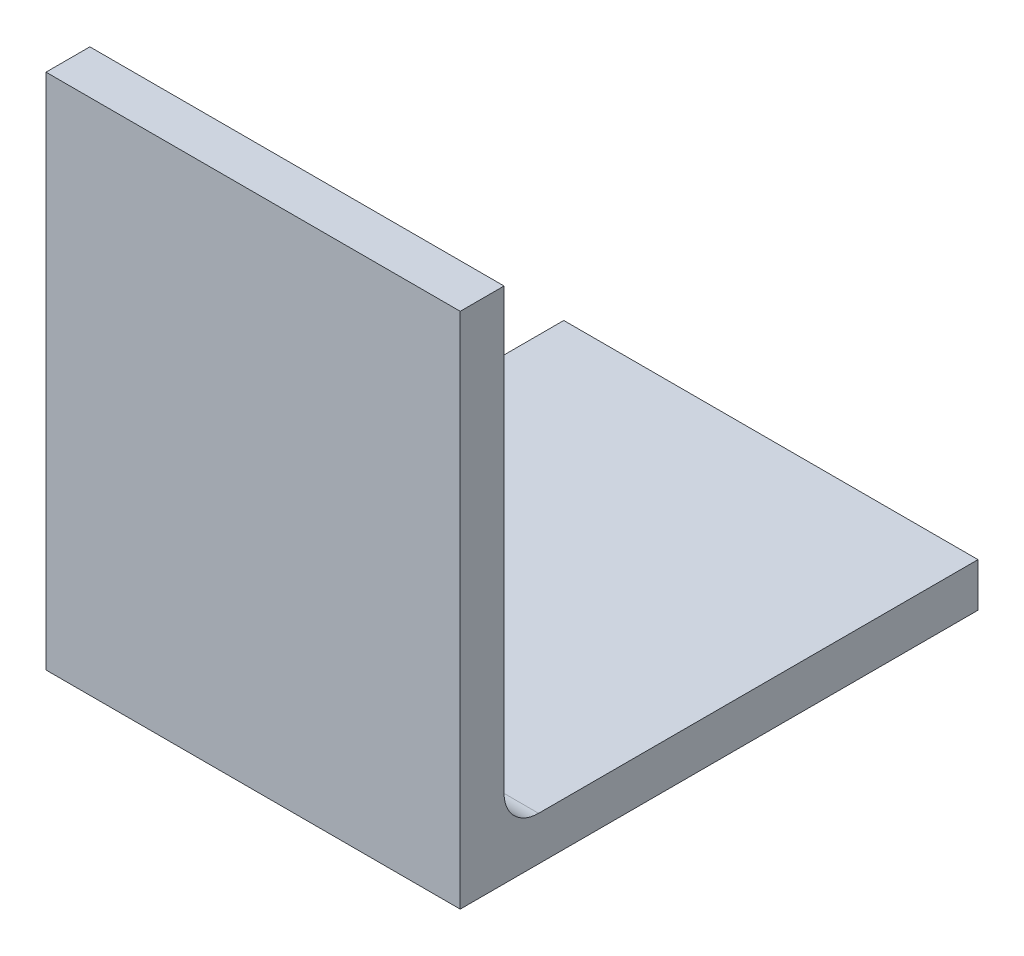
ISO-10303-21;
HEADER;
FILE_DESCRIPTION(('STEP AP214'),'2;1');
FILE_NAME('part.step','',(''),(''),'','','');
FILE_SCHEMA(('AUTOMOTIVE_DESIGN { 1 0 10303 214 1 1 1 1 }'));
ENDSEC;
DATA;
#1=APPLICATION_CONTEXT('core data for automotive mechanical design processes');
#2=APPLICATION_PROTOCOL_DEFINITION('international standard','automotive_design',2000,#1);
#3=PRODUCT_CONTEXT('',#1,'mechanical');
#4=PRODUCT('Part','Part','',(#3));
#5=PRODUCT_RELATED_PRODUCT_CATEGORY('part','',(#4));
#6=PRODUCT_DEFINITION_FORMATION('','',#4);
#7=PRODUCT_DEFINITION_CONTEXT('part definition',#1,'design');
#8=PRODUCT_DEFINITION('design','',#6,#7);
#9=PRODUCT_DEFINITION_SHAPE('','',#8);
#10=(LENGTH_UNIT() NAMED_UNIT(*) SI_UNIT(.MILLI.,.METRE.));
#11=(NAMED_UNIT(*) PLANE_ANGLE_UNIT() SI_UNIT($,.RADIAN.));
#12=(NAMED_UNIT(*) SI_UNIT($,.STERADIAN.) SOLID_ANGLE_UNIT());
#13=UNCERTAINTY_MEASURE_WITH_UNIT(LENGTH_MEASURE(1.E-05),#10,'distance_accuracy_value','');
#14=(GEOMETRIC_REPRESENTATION_CONTEXT(3) GLOBAL_UNCERTAINTY_ASSIGNED_CONTEXT((#13)) GLOBAL_UNIT_ASSIGNED_CONTEXT((#10,
#11,#12)) REPRESENTATION_CONTEXT('',''));
#15=CARTESIAN_POINT('',(0.,0.,0.));
#16=DIRECTION('',(0.,0.,1.));
#17=DIRECTION('',(1.,0.,0.));
#18=AXIS2_PLACEMENT_3D('',#15,#16,#17);
#19=CARTESIAN_POINT('',(60.,0.,0.));
#20=DIRECTION('',(0.,1.,0.));
#21=DIRECTION('',(0.,0.,1.));
#22=AXIS2_PLACEMENT_3D('',#19,#20,#21);
#23=PLANE('',#22);
#24=DIRECTION('',(0.,0.,-1.));
#25=VECTOR('',#24,1.);
#26=CARTESIAN_POINT('',(-60.,0.,0.));
#27=LINE('',#26,#25);
#28=CARTESIAN_POINT('',(-60.,0.,0.));
#29=VERTEX_POINT('',#28);
#30=CARTESIAN_POINT('',(-60.,0.,-150.));
#31=VERTEX_POINT('',#30);
#32=EDGE_CURVE('E123',#29,#31,#27,.T.);
#33=ORIENTED_EDGE('',*,*,#32,.T.);
#34=DIRECTION('',(-1.,0.,0.));
#35=VECTOR('',#34,1.);
#36=CARTESIAN_POINT('',(60.,0.,-150.));
#37=LINE('',#36,#35);
#38=CARTESIAN_POINT('',(60.,0.,-150.));
#39=VERTEX_POINT('',#38);
#40=EDGE_CURVE('E11',#39,#31,#37,.T.);
#41=ORIENTED_EDGE('',*,*,#40,.F.);
#42=DIRECTION('',(0.,0.,-1.));
#43=VECTOR('',#42,1.);
#44=CARTESIAN_POINT('',(60.,0.,0.));
#45=LINE('',#44,#43);
#46=CARTESIAN_POINT('',(60.,0.,0.));
#47=VERTEX_POINT('',#46);
#48=EDGE_CURVE('E135',#47,#39,#45,.T.);
#49=ORIENTED_EDGE('',*,*,#48,.F.);
#50=DIRECTION('',(-1.,0.,0.));
#51=VECTOR('',#50,1.);
#52=CARTESIAN_POINT('',(60.,0.,0.));
#53=LINE('',#52,#51);
#54=EDGE_CURVE('E119',#47,#29,#53,.T.);
#55=ORIENTED_EDGE('',*,*,#54,.T.);
#56=EDGE_LOOP('',(#33,#41,#49,#55));
#57=FACE_BOUND('',#56,.T.);
#58=ADVANCED_FACE('F33',(#57),#23,.F.);
#59=CARTESIAN_POINT('',(60.,0.,-150.));
#60=DIRECTION('',(0.,0.,1.));
#61=DIRECTION('',(1.,0.,0.));
#62=AXIS2_PLACEMENT_3D('',#59,#60,#61);
#63=PLANE('',#62);
#64=DIRECTION('',(0.,1.,0.));
#65=VECTOR('',#64,1.);
#66=CARTESIAN_POINT('',(-60.,0.,-150.));
#67=LINE('',#66,#65);
#68=CARTESIAN_POINT('',(-60.,12.7,-150.));
#69=VERTEX_POINT('',#68);
#70=EDGE_CURVE('E126',#31,#69,#67,.T.);
#71=ORIENTED_EDGE('',*,*,#70,.T.);
#72=DIRECTION('',(-1.,0.,0.));
#73=VECTOR('',#72,1.);
#74=CARTESIAN_POINT('',(60.,12.7,-150.));
#75=LINE('',#74,#73);
#76=CARTESIAN_POINT('',(60.,12.7,-150.));
#77=VERTEX_POINT('',#76);
#78=EDGE_CURVE('E41',#77,#69,#75,.T.);
#79=ORIENTED_EDGE('',*,*,#78,.F.);
#80=DIRECTION('',(0.,1.,0.));
#81=VECTOR('',#80,1.);
#82=CARTESIAN_POINT('',(60.,0.,-150.));
#83=LINE('',#82,#81);
#84=EDGE_CURVE('E89',#39,#77,#83,.T.);
#85=ORIENTED_EDGE('',*,*,#84,.F.);
#86=ORIENTED_EDGE('',*,*,#40,.T.);
#87=EDGE_LOOP('',(#71,#79,#85,#86));
#88=FACE_BOUND('',#87,.T.);
#89=ADVANCED_FACE('F160',(#88),#63,.F.);
#90=CARTESIAN_POINT('',(60.,12.7,-22.7000000000001));
#91=DIRECTION('',(0.,-1.,0.));
#92=DIRECTION('',(0.,0.,-1.));
#93=AXIS2_PLACEMENT_3D('',#90,#91,#92);
#94=PLANE('',#93);
#95=DIRECTION('',(0.,0.,1.));
#96=VECTOR('',#95,1.);
#97=CARTESIAN_POINT('',(-60.,12.7,-22.7000000000001));
#98=LINE('',#97,#96);
#99=CARTESIAN_POINT('',(-60.,12.7,-22.7000000000001));
#100=VERTEX_POINT('',#99);
#101=EDGE_CURVE('E128',#69,#100,#98,.T.);
#102=ORIENTED_EDGE('',*,*,#101,.T.);
#103=DIRECTION('',(-1.,0.,0.));
#104=VECTOR('',#103,1.);
#105=CARTESIAN_POINT('',(60.,12.7,-22.7000000000001));
#106=LINE('',#105,#104);
#107=CARTESIAN_POINT('',(60.,12.7,-22.7000000000001));
#108=VERTEX_POINT('',#107);
#109=EDGE_CURVE('E139',#108,#100,#106,.T.);
#110=ORIENTED_EDGE('',*,*,#109,.F.);
#111=DIRECTION('',(0.,0.,1.));
#112=VECTOR('',#111,1.);
#113=CARTESIAN_POINT('',(60.,12.7,-22.7000000000001));
#114=LINE('',#113,#112);
#115=EDGE_CURVE('E147',#77,#108,#114,.T.);
#116=ORIENTED_EDGE('',*,*,#115,.F.);
#117=ORIENTED_EDGE('',*,*,#78,.T.);
#118=EDGE_LOOP('',(#102,#110,#116,#117));
#119=FACE_BOUND('',#118,.T.);
#120=ADVANCED_FACE('F145',(#119),#94,.F.);
#121=CARTESIAN_POINT('',(60.,22.7,-22.7));
#122=DIRECTION('',(-1.,0.,0.));
#123=DIRECTION('',(0.,0.,1.));
#124=AXIS2_PLACEMENT_3D('',#121,#122,#123);
#125=CYLINDRICAL_SURFACE('',#124,10.);
#126=CARTESIAN_POINT('',(-60.,22.7,-22.7));
#127=DIRECTION('',(-1.,0.,0.));
#128=DIRECTION('',(0.,0.,1.));
#129=AXIS2_PLACEMENT_3D('',#126,#127,#128);
#130=CIRCLE('',#129,10.);
#131=CARTESIAN_POINT('',(-60.,22.7000000000001,-12.7));
#132=VERTEX_POINT('',#131);
#133=EDGE_CURVE('E130',#100,#132,#130,.T.);
#134=ORIENTED_EDGE('',*,*,#133,.T.);
#135=DIRECTION('',(-1.,0.,0.));
#136=VECTOR('',#135,1.);
#137=CARTESIAN_POINT('',(60.,22.7000000000001,-12.7));
#138=LINE('',#137,#136);
#139=CARTESIAN_POINT('',(60.,22.7000000000001,-12.7));
#140=VERTEX_POINT('',#139);
#141=EDGE_CURVE('E114',#140,#132,#138,.T.);
#142=ORIENTED_EDGE('',*,*,#141,.F.);
#143=CARTESIAN_POINT('',(60.,22.7,-22.7));
#144=DIRECTION('',(-1.,0.,0.));
#145=DIRECTION('',(0.,0.,1.));
#146=AXIS2_PLACEMENT_3D('',#143,#144,#145);
#147=CIRCLE('',#146,10.);
#148=EDGE_CURVE('E105',#108,#140,#147,.T.);
#149=ORIENTED_EDGE('',*,*,#148,.F.);
#150=ORIENTED_EDGE('',*,*,#109,.T.);
#151=EDGE_LOOP('',(#134,#142,#149,#150));
#152=FACE_BOUND('',#151,.T.);
#153=ADVANCED_FACE('F153',(#152),#125,.F.);
#154=CARTESIAN_POINT('',(60.,22.7000000000001,-12.7));
#155=DIRECTION('',(0.,0.,1.));
#156=DIRECTION('',(1.,0.,0.));
#157=AXIS2_PLACEMENT_3D('',#154,#155,#156);
#158=PLANE('',#157);
#159=DIRECTION('',(0.,1.,0.));
#160=VECTOR('',#159,1.);
#161=CARTESIAN_POINT('',(-60.,22.7000000000001,-12.7));
#162=LINE('',#161,#160);
#163=CARTESIAN_POINT('',(-60.,150.,-12.7));
#164=VERTEX_POINT('',#163);
#165=EDGE_CURVE('E113',#132,#164,#162,.T.);
#166=ORIENTED_EDGE('',*,*,#165,.T.);
#167=DIRECTION('',(-1.,0.,0.));
#168=VECTOR('',#167,1.);
#169=CARTESIAN_POINT('',(60.,150.,-12.7));
#170=LINE('',#169,#168);
#171=CARTESIAN_POINT('',(60.,150.,-12.7));
#172=VERTEX_POINT('',#171);
#173=EDGE_CURVE('E110',#172,#164,#170,.T.);
#174=ORIENTED_EDGE('',*,*,#173,.F.);
#175=DIRECTION('',(0.,1.,0.));
#176=VECTOR('',#175,1.);
#177=CARTESIAN_POINT('',(60.,22.7000000000001,-12.7));
#178=LINE('',#177,#176);
#179=EDGE_CURVE('E99',#140,#172,#178,.T.);
#180=ORIENTED_EDGE('',*,*,#179,.F.);
#181=ORIENTED_EDGE('',*,*,#141,.T.);
#182=EDGE_LOOP('',(#166,#174,#180,#181));
#183=FACE_BOUND('',#182,.T.);
#184=ADVANCED_FACE('F111',(#183),#158,.F.);
#185=CARTESIAN_POINT('',(60.,150.,0.));
#186=DIRECTION('',(0.,-1.,0.));
#187=DIRECTION('',(0.,0.,-1.));
#188=AXIS2_PLACEMENT_3D('',#185,#186,#187);
#189=PLANE('',#188);
#190=DIRECTION('',(0.,0.,1.));
#191=VECTOR('',#190,1.);
#192=CARTESIAN_POINT('',(-60.,150.,0.));
#193=LINE('',#192,#191);
#194=CARTESIAN_POINT('',(-60.,150.,0.));
#195=VERTEX_POINT('',#194);
#196=EDGE_CURVE('E75',#164,#195,#193,.T.);
#197=ORIENTED_EDGE('',*,*,#196,.T.);
#198=DIRECTION('',(-1.,0.,0.));
#199=VECTOR('',#198,1.);
#200=CARTESIAN_POINT('',(60.,150.,0.));
#201=LINE('',#200,#199);
#202=CARTESIAN_POINT('',(60.,150.,0.));
#203=VERTEX_POINT('',#202);
#204=EDGE_CURVE('E115',#203,#195,#201,.T.);
#205=ORIENTED_EDGE('',*,*,#204,.F.);
#206=DIRECTION('',(0.,0.,1.));
#207=VECTOR('',#206,1.);
#208=CARTESIAN_POINT('',(60.,150.,0.));
#209=LINE('',#208,#207);
#210=EDGE_CURVE('E103',#172,#203,#209,.T.);
#211=ORIENTED_EDGE('',*,*,#210,.F.);
#212=ORIENTED_EDGE('',*,*,#173,.T.);
#213=EDGE_LOOP('',(#197,#205,#211,#212));
#214=FACE_BOUND('',#213,.T.);
#215=ADVANCED_FACE('F117',(#214),#189,.F.);
#216=CARTESIAN_POINT('',(60.,0.,0.));
#217=DIRECTION('',(0.,0.,-1.));
#218=DIRECTION('',(-1.,0.,0.));
#219=AXIS2_PLACEMENT_3D('',#216,#217,#218);
#220=PLANE('',#219);
#221=DIRECTION('',(0.,-1.,0.));
#222=VECTOR('',#221,1.);
#223=CARTESIAN_POINT('',(-60.,0.,0.));
#224=LINE('',#223,#222);
#225=EDGE_CURVE('E81',#195,#29,#224,.T.);
#226=ORIENTED_EDGE('',*,*,#225,.T.);
#227=ORIENTED_EDGE('',*,*,#54,.F.);
#228=DIRECTION('',(0.,-1.,0.));
#229=VECTOR('',#228,1.);
#230=CARTESIAN_POINT('',(60.,0.,0.));
#231=LINE('',#230,#229);
#232=EDGE_CURVE('E49',#203,#47,#231,.T.);
#233=ORIENTED_EDGE('',*,*,#232,.F.);
#234=ORIENTED_EDGE('',*,*,#204,.T.);
#235=EDGE_LOOP('',(#226,#227,#233,#234));
#236=FACE_BOUND('',#235,.T.);
#237=ADVANCED_FACE('F174',(#236),#220,.F.);
#238=CARTESIAN_POINT('',(60.,22.7,-22.7));
#239=DIRECTION('',(-1.,0.,0.));
#240=DIRECTION('',(0.,0.,1.));
#241=AXIS2_PLACEMENT_3D('',#238,#239,#240);
#242=PLANE('',#241);
#243=ORIENTED_EDGE('',*,*,#48,.T.);
#244=ORIENTED_EDGE('',*,*,#84,.T.);
#245=ORIENTED_EDGE('',*,*,#115,.T.);
#246=ORIENTED_EDGE('',*,*,#148,.T.);
#247=ORIENTED_EDGE('',*,*,#179,.T.);
#248=ORIENTED_EDGE('',*,*,#210,.T.);
#249=ORIENTED_EDGE('',*,*,#232,.T.);
#250=EDGE_LOOP('',(#243,#244,#245,#246,#247,#248,#249));
#251=FACE_BOUND('',#250,.T.);
#252=ADVANCED_FACE('F101',(#251),#242,.F.);
#253=CARTESIAN_POINT('',(-60.,22.7,-22.7));
#254=DIRECTION('',(-1.,0.,0.));
#255=DIRECTION('',(0.,0.,1.));
#256=AXIS2_PLACEMENT_3D('',#253,#254,#255);
#257=PLANE('',#256);
#258=ORIENTED_EDGE('',*,*,#32,.F.);
#259=ORIENTED_EDGE('',*,*,#225,.F.);
#260=ORIENTED_EDGE('',*,*,#196,.F.);
#261=ORIENTED_EDGE('',*,*,#165,.F.);
#262=ORIENTED_EDGE('',*,*,#133,.F.);
#263=ORIENTED_EDGE('',*,*,#101,.F.);
#264=ORIENTED_EDGE('',*,*,#70,.F.);
#265=EDGE_LOOP('',(#258,#259,#260,#261,#262,#263,#264));
#266=FACE_BOUND('',#265,.T.);
#267=ADVANCED_FACE('F151',(#266),#257,.T.);
#268=CLOSED_SHELL('',(#58,#89,#120,#153,#184,#215,#237,#252,#267));
#269=MANIFOLD_SOLID_BREP('B2',#268);
#270=ADVANCED_BREP_SHAPE_REPRESENTATION('',(#18,#269),#14);
#271=SHAPE_DEFINITION_REPRESENTATION(#9,#270);
ENDSEC;
END-ISO-10303-21;
